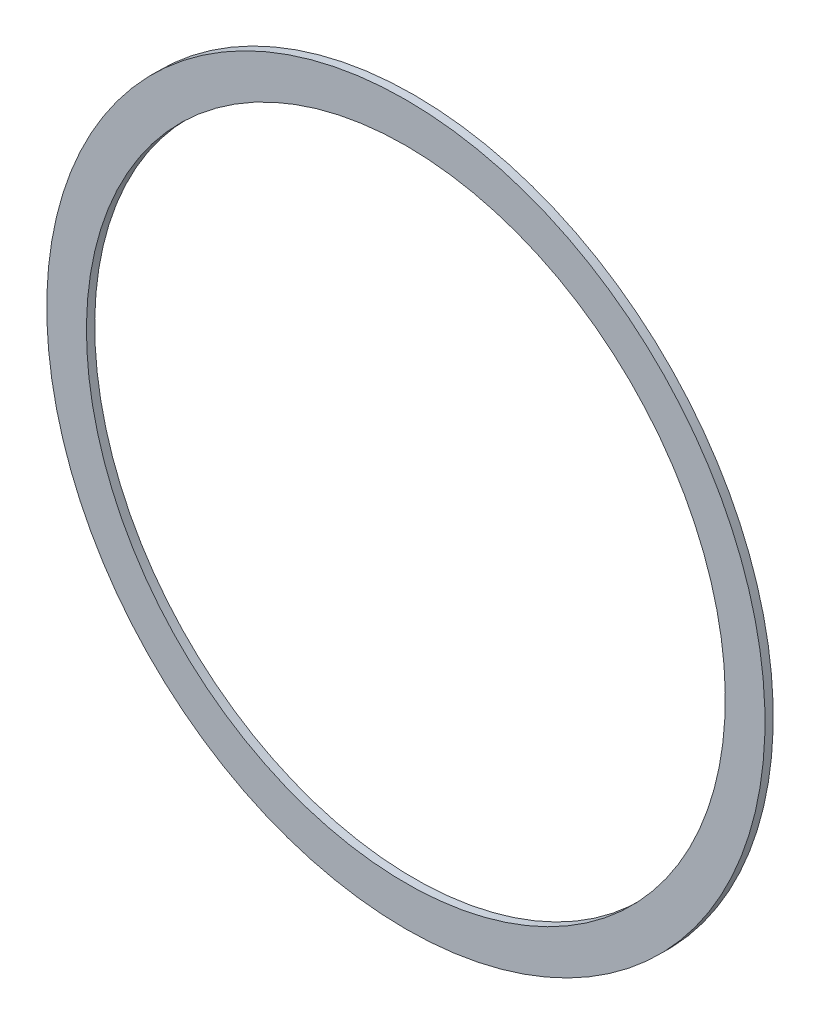
ISO-10303-21;
HEADER;
FILE_DESCRIPTION(('STEP AP214'),'2;1');
FILE_NAME('part.step','',(''),(''),'','','');
FILE_SCHEMA(('AUTOMOTIVE_DESIGN { 1 0 10303 214 1 1 1 1 }'));
ENDSEC;
DATA;
#1=APPLICATION_CONTEXT('core data for automotive mechanical design processes');
#2=APPLICATION_PROTOCOL_DEFINITION('international standard','automotive_design',2000,#1);
#3=PRODUCT_CONTEXT('',#1,'mechanical');
#4=PRODUCT('Part','Part','',(#3));
#5=PRODUCT_RELATED_PRODUCT_CATEGORY('part','',(#4));
#6=PRODUCT_DEFINITION_FORMATION('','',#4);
#7=PRODUCT_DEFINITION_CONTEXT('part definition',#1,'design');
#8=PRODUCT_DEFINITION('design','',#6,#7);
#9=PRODUCT_DEFINITION_SHAPE('','',#8);
#10=(LENGTH_UNIT() NAMED_UNIT(*) SI_UNIT(.MILLI.,.METRE.));
#11=(NAMED_UNIT(*) PLANE_ANGLE_UNIT() SI_UNIT($,.RADIAN.));
#12=(NAMED_UNIT(*) SI_UNIT($,.STERADIAN.) SOLID_ANGLE_UNIT());
#13=UNCERTAINTY_MEASURE_WITH_UNIT(LENGTH_MEASURE(1.E-05),#10,'distance_accuracy_value','');
#14=(GEOMETRIC_REPRESENTATION_CONTEXT(3) GLOBAL_UNCERTAINTY_ASSIGNED_CONTEXT((#13)) GLOBAL_UNIT_ASSIGNED_CONTEXT((#10,
#11,#12)) REPRESENTATION_CONTEXT('',''));
#15=CARTESIAN_POINT('',(0.,0.,0.));
#16=DIRECTION('',(0.,0.,1.));
#17=DIRECTION('',(1.,0.,0.));
#18=AXIS2_PLACEMENT_3D('',#15,#16,#17);
#19=CARTESIAN_POINT('',(0.,12.7,-1.58750000000001));
#20=DIRECTION('',(0.,0.,-1.));
#21=DIRECTION('',(0.,1.,0.));
#22=AXIS2_PLACEMENT_3D('',#19,#20,#21);
#23=PLANE('',#22);
#24=CARTESIAN_POINT('',(0.,12.7,-1.58750000000001));
#25=DIRECTION('',(0.,0.,-1.));
#26=DIRECTION('',(0.,1.,0.));
#27=AXIS2_PLACEMENT_3D('',#24,#25,#26);
#28=CIRCLE('',#27,137.922);
#29=CARTESIAN_POINT('',(0.,150.622,-1.58750000000002));
#30=VERTEX_POINT('',#29);
#31=EDGE_CURVE('E10',#30,#30,#28,.T.);
#32=ORIENTED_EDGE('',*,*,#31,.T.);
#33=EDGE_LOOP('',(#32));
#34=FACE_BOUND('',#33,.T.);
#35=CARTESIAN_POINT('',(0.,12.7,-1.58750000000001));
#36=DIRECTION('',(0.,0.,-1.));
#37=DIRECTION('',(0.,1.,0.));
#38=AXIS2_PLACEMENT_3D('',#35,#36,#37);
#39=CIRCLE('',#38,122.682);
#40=CARTESIAN_POINT('',(0.,135.382,-1.58750000000002));
#41=VERTEX_POINT('',#40);
#42=EDGE_CURVE('E46',#41,#41,#39,.T.);
#43=ORIENTED_EDGE('',*,*,#42,.F.);
#44=EDGE_LOOP('',(#43));
#45=FACE_BOUND('',#44,.T.);
#46=ADVANCED_FACE('F35',(#34,#45),#23,.T.);
#47=CARTESIAN_POINT('',(0.,12.7,1.58749999999999));
#48=DIRECTION('',(0.,0.,-1.));
#49=DIRECTION('',(0.,1.,0.));
#50=AXIS2_PLACEMENT_3D('',#47,#48,#49);
#51=PLANE('',#50);
#52=CARTESIAN_POINT('',(0.,12.7,1.58749999999999));
#53=DIRECTION('',(0.,0.,-1.));
#54=DIRECTION('',(0.,1.,0.));
#55=AXIS2_PLACEMENT_3D('',#52,#53,#54);
#56=CIRCLE('',#55,137.922);
#57=CARTESIAN_POINT('',(0.,150.622,1.58749999999998));
#58=VERTEX_POINT('',#57);
#59=EDGE_CURVE('E39',#58,#58,#56,.T.);
#60=ORIENTED_EDGE('',*,*,#59,.F.);
#61=EDGE_LOOP('',(#60));
#62=FACE_BOUND('',#61,.T.);
#63=CARTESIAN_POINT('',(0.,12.7,1.58749999999999));
#64=DIRECTION('',(0.,0.,-1.));
#65=DIRECTION('',(0.,1.,0.));
#66=AXIS2_PLACEMENT_3D('',#63,#64,#65);
#67=CIRCLE('',#66,122.682);
#68=CARTESIAN_POINT('',(0.,135.382,1.58749999999998));
#69=VERTEX_POINT('',#68);
#70=EDGE_CURVE('E48',#69,#69,#67,.T.);
#71=ORIENTED_EDGE('',*,*,#70,.T.);
#72=EDGE_LOOP('',(#71));
#73=FACE_BOUND('',#72,.T.);
#74=ADVANCED_FACE('F58',(#62,#73),#51,.F.);
#75=CARTESIAN_POINT('',(0.,12.7,-1.58750000000001));
#76=DIRECTION('',(0.,0.,1.));
#77=DIRECTION('',(0.,-1.,0.));
#78=AXIS2_PLACEMENT_3D('',#75,#76,#77);
#79=CYLINDRICAL_SURFACE('',#78,137.922);
#80=ORIENTED_EDGE('',*,*,#31,.F.);
#81=EDGE_LOOP('',(#80));
#82=FACE_BOUND('',#81,.T.);
#83=ORIENTED_EDGE('',*,*,#59,.T.);
#84=EDGE_LOOP('',(#83));
#85=FACE_BOUND('',#84,.T.);
#86=ADVANCED_FACE('F37',(#82,#85),#79,.T.);
#87=CARTESIAN_POINT('',(0.,12.7,-1.58750000000001));
#88=DIRECTION('',(0.,0.,1.));
#89=DIRECTION('',(0.,-1.,0.));
#90=AXIS2_PLACEMENT_3D('',#87,#88,#89);
#91=CYLINDRICAL_SURFACE('',#90,122.682);
#92=ORIENTED_EDGE('',*,*,#42,.T.);
#93=EDGE_LOOP('',(#92));
#94=FACE_BOUND('',#93,.T.);
#95=ORIENTED_EDGE('',*,*,#70,.F.);
#96=EDGE_LOOP('',(#95));
#97=FACE_BOUND('',#96,.T.);
#98=ADVANCED_FACE('F54',(#94,#97),#91,.F.);
#99=CLOSED_SHELL('',(#46,#74,#86,#98));
#100=MANIFOLD_SOLID_BREP('B2',#99);
#101=ADVANCED_BREP_SHAPE_REPRESENTATION('',(#18,#100),#14);
#102=SHAPE_DEFINITION_REPRESENTATION(#9,#101);
ENDSEC;
END-ISO-10303-21;
